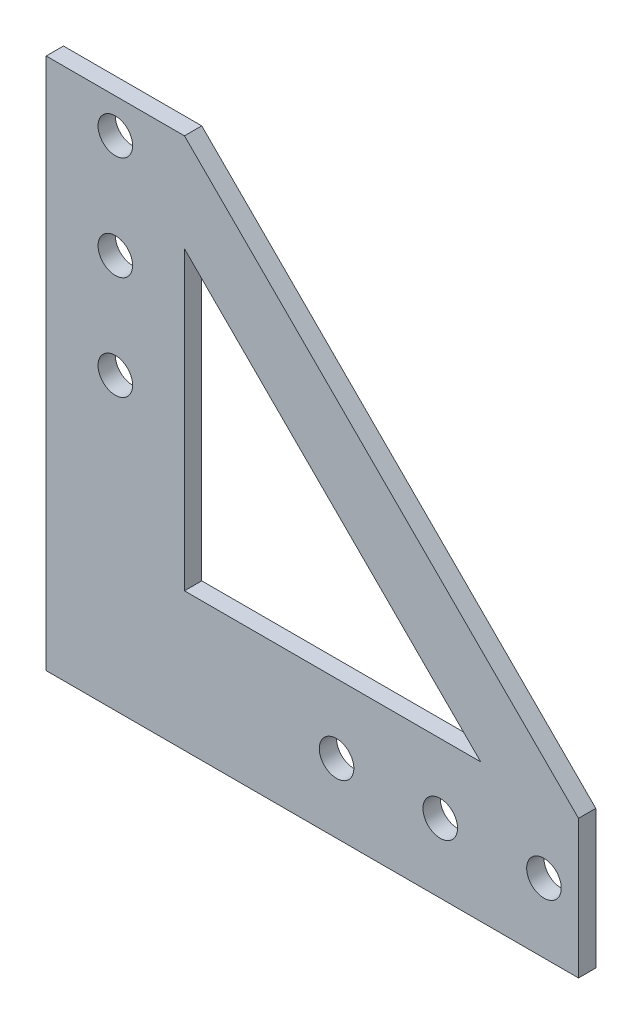
ISO-10303-21;
HEADER;
FILE_DESCRIPTION(('STEP AP214'),'2;1');
FILE_NAME('part.step','',(''),(''),'','','');
FILE_SCHEMA(('AUTOMOTIVE_DESIGN { 1 0 10303 214 1 1 1 1 }'));
ENDSEC;
DATA;
#1=APPLICATION_CONTEXT('core data for automotive mechanical design processes');
#2=APPLICATION_PROTOCOL_DEFINITION('international standard','automotive_design',2000,#1);
#3=PRODUCT_CONTEXT('',#1,'mechanical');
#4=PRODUCT('Part','Part','',(#3));
#5=PRODUCT_RELATED_PRODUCT_CATEGORY('part','',(#4));
#6=PRODUCT_DEFINITION_FORMATION('','',#4);
#7=PRODUCT_DEFINITION_CONTEXT('part definition',#1,'design');
#8=PRODUCT_DEFINITION('design','',#6,#7);
#9=PRODUCT_DEFINITION_SHAPE('','',#8);
#10=(LENGTH_UNIT() NAMED_UNIT(*) SI_UNIT(.MILLI.,.METRE.));
#11=(NAMED_UNIT(*) PLANE_ANGLE_UNIT() SI_UNIT($,.RADIAN.));
#12=(NAMED_UNIT(*) SI_UNIT($,.STERADIAN.) SOLID_ANGLE_UNIT());
#13=UNCERTAINTY_MEASURE_WITH_UNIT(LENGTH_MEASURE(1.E-05),#10,'distance_accuracy_value','');
#14=(GEOMETRIC_REPRESENTATION_CONTEXT(3) GLOBAL_UNCERTAINTY_ASSIGNED_CONTEXT((#13)) GLOBAL_UNIT_ASSIGNED_CONTEXT((#10,
#11,#12)) REPRESENTATION_CONTEXT('',''));
#15=CARTESIAN_POINT('',(0.,0.,0.));
#16=DIRECTION('',(0.,0.,1.));
#17=DIRECTION('',(1.,0.,0.));
#18=AXIS2_PLACEMENT_3D('',#15,#16,#17);
#19=CARTESIAN_POINT('',(0.,0.,3.175));
#20=DIRECTION('',(0.,1.,0.));
#21=DIRECTION('',(0.,0.,1.));
#22=AXIS2_PLACEMENT_3D('',#19,#20,#21);
#23=PLANE('',#22);
#24=DIRECTION('',(1.,0.,0.));
#25=VECTOR('',#24,1.);
#26=CARTESIAN_POINT('',(0.,0.,0.));
#27=LINE('',#26,#25);
#28=CARTESIAN_POINT('',(0.,0.,0.));
#29=VERTEX_POINT('',#28);
#30=CARTESIAN_POINT('',(97.79,0.,0.));
#31=VERTEX_POINT('',#30);
#32=EDGE_CURVE('E145',#29,#31,#27,.T.);
#33=ORIENTED_EDGE('',*,*,#32,.T.);
#34=DIRECTION('',(0.,0.,-1.));
#35=VECTOR('',#34,1.);
#36=CARTESIAN_POINT('',(97.79,0.,3.175));
#37=LINE('',#36,#35);
#38=CARTESIAN_POINT('',(97.79,0.,3.175));
#39=VERTEX_POINT('',#38);
#40=EDGE_CURVE('E11',#39,#31,#37,.T.);
#41=ORIENTED_EDGE('',*,*,#40,.F.);
#42=DIRECTION('',(1.,0.,0.));
#43=VECTOR('',#42,1.);
#44=CARTESIAN_POINT('',(0.,0.,3.175));
#45=LINE('',#44,#43);
#46=CARTESIAN_POINT('',(0.,0.,3.175));
#47=VERTEX_POINT('',#46);
#48=EDGE_CURVE('E177',#47,#39,#45,.T.);
#49=ORIENTED_EDGE('',*,*,#48,.F.);
#50=DIRECTION('',(0.,0.,-1.));
#51=VECTOR('',#50,1.);
#52=CARTESIAN_POINT('',(0.,0.,3.175));
#53=LINE('',#52,#51);
#54=EDGE_CURVE('E54',#47,#29,#53,.T.);
#55=ORIENTED_EDGE('',*,*,#54,.T.);
#56=EDGE_LOOP('',(#33,#41,#49,#55));
#57=FACE_BOUND('',#56,.T.);
#58=ADVANCED_FACE('F35',(#57),#23,.F.);
#59=CARTESIAN_POINT('',(97.79,0.,3.175));
#60=DIRECTION('',(-1.,0.,0.));
#61=DIRECTION('',(0.,-1.,0.));
#62=AXIS2_PLACEMENT_3D('',#59,#60,#61);
#63=PLANE('',#62);
#64=DIRECTION('',(0.,1.,0.));
#65=VECTOR('',#64,1.);
#66=CARTESIAN_POINT('',(97.79,0.,0.));
#67=LINE('',#66,#65);
#68=CARTESIAN_POINT('',(97.79,25.4,0.));
#69=VERTEX_POINT('',#68);
#70=EDGE_CURVE('E147',#31,#69,#67,.T.);
#71=ORIENTED_EDGE('',*,*,#70,.T.);
#72=DIRECTION('',(0.,0.,-1.));
#73=VECTOR('',#72,1.);
#74=CARTESIAN_POINT('',(97.79,25.4,3.175));
#75=LINE('',#74,#73);
#76=CARTESIAN_POINT('',(97.79,25.4,3.175));
#77=VERTEX_POINT('',#76);
#78=EDGE_CURVE('E45',#77,#69,#75,.T.);
#79=ORIENTED_EDGE('',*,*,#78,.F.);
#80=DIRECTION('',(0.,1.,0.));
#81=VECTOR('',#80,1.);
#82=CARTESIAN_POINT('',(97.79,0.,3.175));
#83=LINE('',#82,#81);
#84=EDGE_CURVE('E125',#39,#77,#83,.T.);
#85=ORIENTED_EDGE('',*,*,#84,.F.);
#86=ORIENTED_EDGE('',*,*,#40,.T.);
#87=EDGE_LOOP('',(#71,#79,#85,#86));
#88=FACE_BOUND('',#87,.T.);
#89=ADVANCED_FACE('F256',(#88),#63,.F.);
#90=CARTESIAN_POINT('',(61.595,61.595,3.175));
#91=DIRECTION('',(0.707106781186548,0.707106781186548,0.));
#92=DIRECTION('',(-0.707106781186548,0.707106781186548,0.));
#93=AXIS2_PLACEMENT_3D('',#90,#91,#92);
#94=PLANE('',#93);
#95=DIRECTION('',(0.707106781186548,-0.707106781186548,0.));
#96=VECTOR('',#95,1.);
#97=CARTESIAN_POINT('',(61.595,61.595,0.));
#98=LINE('',#97,#96);
#99=CARTESIAN_POINT('',(25.4,97.79,0.));
#100=VERTEX_POINT('',#99);
#101=EDGE_CURVE('E114',#100,#69,#98,.T.);
#102=ORIENTED_EDGE('',*,*,#101,.F.);
#103=DIRECTION('',(0.,0.,-1.));
#104=VECTOR('',#103,1.);
#105=CARTESIAN_POINT('',(25.4,97.79,3.175));
#106=LINE('',#105,#104);
#107=CARTESIAN_POINT('',(25.4,97.79,3.175));
#108=VERTEX_POINT('',#107);
#109=EDGE_CURVE('E109',#108,#100,#106,.T.);
#110=ORIENTED_EDGE('',*,*,#109,.F.);
#111=DIRECTION('',(0.707106781186548,-0.707106781186548,0.));
#112=VECTOR('',#111,1.);
#113=CARTESIAN_POINT('',(61.595,61.595,3.175));
#114=LINE('',#113,#112);
#115=EDGE_CURVE('E112',#108,#77,#114,.T.);
#116=ORIENTED_EDGE('',*,*,#115,.T.);
#117=ORIENTED_EDGE('',*,*,#78,.T.);
#118=EDGE_LOOP('',(#102,#110,#116,#117));
#119=FACE_BOUND('',#118,.T.);
#120=ADVANCED_FACE('F111',(#119),#94,.T.);
#121=CARTESIAN_POINT('',(0.,97.79,3.175));
#122=DIRECTION('',(0.,1.,0.));
#123=DIRECTION('',(0.,0.,1.));
#124=AXIS2_PLACEMENT_3D('',#121,#122,#123);
#125=PLANE('',#124);
#126=DIRECTION('',(1.,0.,0.));
#127=VECTOR('',#126,1.);
#128=CARTESIAN_POINT('',(0.,97.79,0.));
#129=LINE('',#128,#127);
#130=CARTESIAN_POINT('',(0.,97.79,0.));
#131=VERTEX_POINT('',#130);
#132=EDGE_CURVE('E151',#131,#100,#129,.T.);
#133=ORIENTED_EDGE('',*,*,#132,.F.);
#134=DIRECTION('',(0.,0.,-1.));
#135=VECTOR('',#134,1.);
#136=CARTESIAN_POINT('',(0.,97.79,3.175));
#137=LINE('',#136,#135);
#138=CARTESIAN_POINT('',(0.,97.79,3.175));
#139=VERTEX_POINT('',#138);
#140=EDGE_CURVE('E80',#139,#131,#137,.T.);
#141=ORIENTED_EDGE('',*,*,#140,.F.);
#142=DIRECTION('',(1.,0.,0.));
#143=VECTOR('',#142,1.);
#144=CARTESIAN_POINT('',(0.,97.79,3.175));
#145=LINE('',#144,#143);
#146=EDGE_CURVE('E124',#139,#108,#145,.T.);
#147=ORIENTED_EDGE('',*,*,#146,.T.);
#148=ORIENTED_EDGE('',*,*,#109,.T.);
#149=EDGE_LOOP('',(#133,#141,#147,#148));
#150=FACE_BOUND('',#149,.T.);
#151=ADVANCED_FACE('F128',(#150),#125,.T.);
#152=CARTESIAN_POINT('',(25.4,0.,3.175));
#153=DIRECTION('',(-1.,0.,0.));
#154=DIRECTION('',(0.,-1.,0.));
#155=AXIS2_PLACEMENT_3D('',#152,#153,#154);
#156=PLANE('',#155);
#157=DIRECTION('',(0.,1.,0.));
#158=VECTOR('',#157,1.);
#159=CARTESIAN_POINT('',(25.4,0.,0.));
#160=LINE('',#159,#158);
#161=CARTESIAN_POINT('',(25.4,25.4,0.));
#162=VERTEX_POINT('',#161);
#163=CARTESIAN_POINT('',(25.4,79.8294877578617,0.));
#164=VERTEX_POINT('',#163);
#165=EDGE_CURVE('E135',#162,#164,#160,.T.);
#166=ORIENTED_EDGE('',*,*,#165,.T.);
#167=DIRECTION('',(0.,0.,-1.));
#168=VECTOR('',#167,1.);
#169=CARTESIAN_POINT('',(25.4,79.8294877578617,3.175));
#170=LINE('',#169,#168);
#171=CARTESIAN_POINT('',(25.4,79.8294877578617,3.175));
#172=VERTEX_POINT('',#171);
#173=EDGE_CURVE('E39',#172,#164,#170,.T.);
#174=ORIENTED_EDGE('',*,*,#173,.F.);
#175=DIRECTION('',(0.,1.,0.));
#176=VECTOR('',#175,1.);
#177=CARTESIAN_POINT('',(25.4,0.,3.175));
#178=LINE('',#177,#176);
#179=CARTESIAN_POINT('',(25.4,25.4,3.175));
#180=VERTEX_POINT('',#179);
#181=EDGE_CURVE('E156',#180,#172,#178,.T.);
#182=ORIENTED_EDGE('',*,*,#181,.F.);
#183=DIRECTION('',(0.,0.,-1.));
#184=VECTOR('',#183,1.);
#185=CARTESIAN_POINT('',(25.4,25.4,3.175));
#186=LINE('',#185,#184);
#187=EDGE_CURVE('E131',#180,#162,#186,.T.);
#188=ORIENTED_EDGE('',*,*,#187,.T.);
#189=EDGE_LOOP('',(#166,#174,#182,#188));
#190=FACE_BOUND('',#189,.T.);
#191=ADVANCED_FACE('F37',(#190),#156,.F.);
#192=CARTESIAN_POINT('',(52.6147438789308,52.6147438789309,3.175));
#193=DIRECTION('',(0.707106781186547,0.707106781186548,0.));
#194=DIRECTION('',(-0.707106781186548,0.707106781186547,0.));
#195=AXIS2_PLACEMENT_3D('',#192,#193,#194);
#196=PLANE('',#195);
#197=DIRECTION('',(0.707106781186548,-0.707106781186547,0.));
#198=VECTOR('',#197,1.);
#199=CARTESIAN_POINT('',(52.6147438789308,52.6147438789309,0.));
#200=LINE('',#199,#198);
#201=CARTESIAN_POINT('',(79.8294877578617,25.4,0.));
#202=VERTEX_POINT('',#201);
#203=EDGE_CURVE('E138',#164,#202,#200,.T.);
#204=ORIENTED_EDGE('',*,*,#203,.T.);
#205=DIRECTION('',(0.,0.,-1.));
#206=VECTOR('',#205,1.);
#207=CARTESIAN_POINT('',(79.8294877578617,25.4,3.175));
#208=LINE('',#207,#206);
#209=CARTESIAN_POINT('',(79.8294877578617,25.4,3.175));
#210=VERTEX_POINT('',#209);
#211=EDGE_CURVE('E160',#210,#202,#208,.T.);
#212=ORIENTED_EDGE('',*,*,#211,.F.);
#213=DIRECTION('',(0.707106781186548,-0.707106781186547,0.));
#214=VECTOR('',#213,1.);
#215=CARTESIAN_POINT('',(52.6147438789308,52.6147438789309,3.175));
#216=LINE('',#215,#214);
#217=EDGE_CURVE('E93',#172,#210,#216,.T.);
#218=ORIENTED_EDGE('',*,*,#217,.F.);
#219=ORIENTED_EDGE('',*,*,#173,.T.);
#220=EDGE_LOOP('',(#204,#212,#218,#219));
#221=FACE_BOUND('',#220,.T.);
#222=ADVANCED_FACE('F165',(#221),#196,.F.);
#223=CARTESIAN_POINT('',(0.,25.4,3.175));
#224=DIRECTION('',(0.,1.,0.));
#225=DIRECTION('',(-1.,0.,0.));
#226=AXIS2_PLACEMENT_3D('',#223,#224,#225);
#227=PLANE('',#226);
#228=DIRECTION('',(1.,0.,0.));
#229=VECTOR('',#228,1.);
#230=CARTESIAN_POINT('',(0.,25.4,0.));
#231=LINE('',#230,#229);
#232=EDGE_CURVE('E142',#162,#202,#231,.T.);
#233=ORIENTED_EDGE('',*,*,#232,.F.);
#234=ORIENTED_EDGE('',*,*,#187,.F.);
#235=DIRECTION('',(1.,0.,0.));
#236=VECTOR('',#235,1.);
#237=CARTESIAN_POINT('',(0.,25.4,3.175));
#238=LINE('',#237,#236);
#239=EDGE_CURVE('E174',#180,#210,#238,.T.);
#240=ORIENTED_EDGE('',*,*,#239,.T.);
#241=ORIENTED_EDGE('',*,*,#211,.T.);
#242=EDGE_LOOP('',(#233,#234,#240,#241));
#243=FACE_BOUND('',#242,.T.);
#244=ADVANCED_FACE('F172',(#243),#227,.T.);
#245=CARTESIAN_POINT('',(0.,0.,3.175));
#246=DIRECTION('',(-1.,0.,0.));
#247=DIRECTION('',(0.,0.,1.));
#248=AXIS2_PLACEMENT_3D('',#245,#246,#247);
#249=PLANE('',#248);
#250=DIRECTION('',(0.,1.,0.));
#251=VECTOR('',#250,1.);
#252=CARTESIAN_POINT('',(0.,0.,0.));
#253=LINE('',#252,#251);
#254=EDGE_CURVE('E153',#29,#131,#253,.T.);
#255=ORIENTED_EDGE('',*,*,#254,.F.);
#256=ORIENTED_EDGE('',*,*,#54,.F.);
#257=DIRECTION('',(0.,1.,0.));
#258=VECTOR('',#257,1.);
#259=CARTESIAN_POINT('',(0.,0.,3.175));
#260=LINE('',#259,#258);
#261=EDGE_CURVE('E129',#47,#139,#260,.T.);
#262=ORIENTED_EDGE('',*,*,#261,.T.);
#263=ORIENTED_EDGE('',*,*,#140,.T.);
#264=EDGE_LOOP('',(#255,#256,#262,#263));
#265=FACE_BOUND('',#264,.T.);
#266=ADVANCED_FACE('F229',(#265),#249,.T.);
#267=CARTESIAN_POINT('',(0.,0.,3.175));
#268=DIRECTION('',(0.,0.,1.));
#269=DIRECTION('',(1.,0.,0.));
#270=AXIS2_PLACEMENT_3D('',#267,#268,#269);
#271=PLANE('',#270);
#272=CARTESIAN_POINT('',(91.44,12.7,3.175));
#273=DIRECTION('',(0.,0.,1.));
#274=DIRECTION('',(1.,0.,0.));
#275=AXIS2_PLACEMENT_3D('',#272,#273,#274);
#276=CIRCLE('',#275,3.175);
#277=CARTESIAN_POINT('',(94.615,12.7,3.175));
#278=VERTEX_POINT('',#277);
#279=EDGE_CURVE('E212',#278,#278,#276,.T.);
#280=ORIENTED_EDGE('',*,*,#279,.F.);
#281=EDGE_LOOP('',(#280));
#282=FACE_BOUND('',#281,.T.);
#283=CARTESIAN_POINT('',(12.7,91.44,3.175));
#284=DIRECTION('',(0.,0.,1.));
#285=DIRECTION('',(1.,0.,0.));
#286=AXIS2_PLACEMENT_3D('',#283,#284,#285);
#287=CIRCLE('',#286,3.175);
#288=CARTESIAN_POINT('',(15.875,91.44,3.175));
#289=VERTEX_POINT('',#288);
#290=EDGE_CURVE('E206',#289,#289,#287,.T.);
#291=ORIENTED_EDGE('',*,*,#290,.F.);
#292=EDGE_LOOP('',(#291));
#293=FACE_BOUND('',#292,.T.);
#294=CARTESIAN_POINT('',(12.7,72.39,3.175));
#295=DIRECTION('',(0.,0.,1.));
#296=DIRECTION('',(1.,0.,0.));
#297=AXIS2_PLACEMENT_3D('',#294,#295,#296);
#298=CIRCLE('',#297,3.175);
#299=CARTESIAN_POINT('',(15.875,72.39,3.175));
#300=VERTEX_POINT('',#299);
#301=EDGE_CURVE('E200',#300,#300,#298,.T.);
#302=ORIENTED_EDGE('',*,*,#301,.F.);
#303=EDGE_LOOP('',(#302));
#304=FACE_BOUND('',#303,.T.);
#305=CARTESIAN_POINT('',(12.7,53.34,3.175));
#306=DIRECTION('',(0.,0.,1.));
#307=DIRECTION('',(1.,0.,0.));
#308=AXIS2_PLACEMENT_3D('',#305,#306,#307);
#309=CIRCLE('',#308,3.175);
#310=CARTESIAN_POINT('',(15.875,53.34,3.175));
#311=VERTEX_POINT('',#310);
#312=EDGE_CURVE('E194',#311,#311,#309,.T.);
#313=ORIENTED_EDGE('',*,*,#312,.F.);
#314=EDGE_LOOP('',(#313));
#315=FACE_BOUND('',#314,.T.);
#316=CARTESIAN_POINT('',(72.39,12.7,3.175));
#317=DIRECTION('',(0.,0.,1.));
#318=DIRECTION('',(1.,0.,0.));
#319=AXIS2_PLACEMENT_3D('',#316,#317,#318);
#320=CIRCLE('',#319,3.175);
#321=CARTESIAN_POINT('',(75.565,12.7,3.175));
#322=VERTEX_POINT('',#321);
#323=EDGE_CURVE('E188',#322,#322,#320,.T.);
#324=ORIENTED_EDGE('',*,*,#323,.F.);
#325=EDGE_LOOP('',(#324));
#326=FACE_BOUND('',#325,.T.);
#327=CARTESIAN_POINT('',(53.34,12.7,3.175));
#328=DIRECTION('',(0.,0.,1.));
#329=DIRECTION('',(1.,0.,0.));
#330=AXIS2_PLACEMENT_3D('',#327,#328,#329);
#331=CIRCLE('',#330,3.175);
#332=CARTESIAN_POINT('',(56.515,12.7,3.175));
#333=VERTEX_POINT('',#332);
#334=EDGE_CURVE('E182',#333,#333,#331,.T.);
#335=ORIENTED_EDGE('',*,*,#334,.F.);
#336=EDGE_LOOP('',(#335));
#337=FACE_BOUND('',#336,.T.);
#338=ORIENTED_EDGE('',*,*,#181,.T.);
#339=ORIENTED_EDGE('',*,*,#217,.T.);
#340=ORIENTED_EDGE('',*,*,#239,.F.);
#341=EDGE_LOOP('',(#338,#339,#340));
#342=FACE_BOUND('',#341,.T.);
#343=ORIENTED_EDGE('',*,*,#48,.T.);
#344=ORIENTED_EDGE('',*,*,#84,.T.);
#345=ORIENTED_EDGE('',*,*,#115,.F.);
#346=ORIENTED_EDGE('',*,*,#146,.F.);
#347=ORIENTED_EDGE('',*,*,#261,.F.);
#348=EDGE_LOOP('',(#343,#344,#345,#346,#347));
#349=FACE_BOUND('',#348,.T.);
#350=ADVANCED_FACE('F122',(#282,#293,#304,#315,#326,#337,#342,#349),#271,.T.);
#351=CARTESIAN_POINT('',(0.,0.,0.));
#352=DIRECTION('',(0.,0.,1.));
#353=DIRECTION('',(1.,0.,0.));
#354=AXIS2_PLACEMENT_3D('',#351,#352,#353);
#355=PLANE('',#354);
#356=CARTESIAN_POINT('',(91.44,12.7,0.));
#357=DIRECTION('',(0.,0.,1.));
#358=DIRECTION('',(1.,0.,0.));
#359=AXIS2_PLACEMENT_3D('',#356,#357,#358);
#360=CIRCLE('',#359,3.175);
#361=CARTESIAN_POINT('',(94.615,12.7,0.));
#362=VERTEX_POINT('',#361);
#363=EDGE_CURVE('E209',#362,#362,#360,.T.);
#364=ORIENTED_EDGE('',*,*,#363,.T.);
#365=EDGE_LOOP('',(#364));
#366=FACE_BOUND('',#365,.T.);
#367=CARTESIAN_POINT('',(12.7,91.44,0.));
#368=DIRECTION('',(0.,0.,1.));
#369=DIRECTION('',(1.,0.,0.));
#370=AXIS2_PLACEMENT_3D('',#367,#368,#369);
#371=CIRCLE('',#370,3.175);
#372=CARTESIAN_POINT('',(15.875,91.44,0.));
#373=VERTEX_POINT('',#372);
#374=EDGE_CURVE('E203',#373,#373,#371,.T.);
#375=ORIENTED_EDGE('',*,*,#374,.T.);
#376=EDGE_LOOP('',(#375));
#377=FACE_BOUND('',#376,.T.);
#378=CARTESIAN_POINT('',(12.7,72.39,0.));
#379=DIRECTION('',(0.,0.,1.));
#380=DIRECTION('',(1.,0.,0.));
#381=AXIS2_PLACEMENT_3D('',#378,#379,#380);
#382=CIRCLE('',#381,3.175);
#383=CARTESIAN_POINT('',(15.875,72.39,0.));
#384=VERTEX_POINT('',#383);
#385=EDGE_CURVE('E197',#384,#384,#382,.T.);
#386=ORIENTED_EDGE('',*,*,#385,.T.);
#387=EDGE_LOOP('',(#386));
#388=FACE_BOUND('',#387,.T.);
#389=CARTESIAN_POINT('',(12.7,53.34,0.));
#390=DIRECTION('',(0.,0.,1.));
#391=DIRECTION('',(1.,0.,0.));
#392=AXIS2_PLACEMENT_3D('',#389,#390,#391);
#393=CIRCLE('',#392,3.175);
#394=CARTESIAN_POINT('',(15.875,53.34,0.));
#395=VERTEX_POINT('',#394);
#396=EDGE_CURVE('E191',#395,#395,#393,.T.);
#397=ORIENTED_EDGE('',*,*,#396,.T.);
#398=EDGE_LOOP('',(#397));
#399=FACE_BOUND('',#398,.T.);
#400=CARTESIAN_POINT('',(72.39,12.7,0.));
#401=DIRECTION('',(0.,0.,1.));
#402=DIRECTION('',(1.,0.,0.));
#403=AXIS2_PLACEMENT_3D('',#400,#401,#402);
#404=CIRCLE('',#403,3.175);
#405=CARTESIAN_POINT('',(75.565,12.7,0.));
#406=VERTEX_POINT('',#405);
#407=EDGE_CURVE('E185',#406,#406,#404,.T.);
#408=ORIENTED_EDGE('',*,*,#407,.T.);
#409=EDGE_LOOP('',(#408));
#410=FACE_BOUND('',#409,.T.);
#411=CARTESIAN_POINT('',(53.34,12.7,0.));
#412=DIRECTION('',(0.,0.,1.));
#413=DIRECTION('',(1.,0.,0.));
#414=AXIS2_PLACEMENT_3D('',#411,#412,#413);
#415=CIRCLE('',#414,3.175);
#416=CARTESIAN_POINT('',(56.515,12.7,0.));
#417=VERTEX_POINT('',#416);
#418=EDGE_CURVE('E139',#417,#417,#415,.T.);
#419=ORIENTED_EDGE('',*,*,#418,.T.);
#420=EDGE_LOOP('',(#419));
#421=FACE_BOUND('',#420,.T.);
#422=ORIENTED_EDGE('',*,*,#165,.F.);
#423=ORIENTED_EDGE('',*,*,#232,.T.);
#424=ORIENTED_EDGE('',*,*,#203,.F.);
#425=EDGE_LOOP('',(#422,#423,#424));
#426=FACE_BOUND('',#425,.T.);
#427=ORIENTED_EDGE('',*,*,#32,.F.);
#428=ORIENTED_EDGE('',*,*,#254,.T.);
#429=ORIENTED_EDGE('',*,*,#132,.T.);
#430=ORIENTED_EDGE('',*,*,#101,.T.);
#431=ORIENTED_EDGE('',*,*,#70,.F.);
#432=EDGE_LOOP('',(#427,#428,#429,#430,#431));
#433=FACE_BOUND('',#432,.T.);
#434=ADVANCED_FACE('F170',(#366,#377,#388,#399,#410,#421,#426,#433),#355,.F.);
#435=CARTESIAN_POINT('',(53.34,12.7,0.));
#436=DIRECTION('',(0.,0.,1.));
#437=DIRECTION('',(1.,0.,0.));
#438=AXIS2_PLACEMENT_3D('',#435,#436,#437);
#439=CYLINDRICAL_SURFACE('',#438,3.175);
#440=ORIENTED_EDGE('',*,*,#418,.F.);
#441=EDGE_LOOP('',(#440));
#442=FACE_BOUND('',#441,.T.);
#443=ORIENTED_EDGE('',*,*,#334,.T.);
#444=EDGE_LOOP('',(#443));
#445=FACE_BOUND('',#444,.T.);
#446=ADVANCED_FACE('F241',(#442,#445),#439,.F.);
#447=CARTESIAN_POINT('',(72.39,12.7,0.));
#448=DIRECTION('',(0.,0.,1.));
#449=DIRECTION('',(1.,0.,0.));
#450=AXIS2_PLACEMENT_3D('',#447,#448,#449);
#451=CYLINDRICAL_SURFACE('',#450,3.175);
#452=ORIENTED_EDGE('',*,*,#407,.F.);
#453=EDGE_LOOP('',(#452));
#454=FACE_BOUND('',#453,.T.);
#455=ORIENTED_EDGE('',*,*,#323,.T.);
#456=EDGE_LOOP('',(#455));
#457=FACE_BOUND('',#456,.T.);
#458=ADVANCED_FACE('F243',(#454,#457),#451,.F.);
#459=CARTESIAN_POINT('',(12.7,53.34,0.));
#460=DIRECTION('',(0.,0.,1.));
#461=DIRECTION('',(1.,0.,0.));
#462=AXIS2_PLACEMENT_3D('',#459,#460,#461);
#463=CYLINDRICAL_SURFACE('',#462,3.175);
#464=ORIENTED_EDGE('',*,*,#396,.F.);
#465=EDGE_LOOP('',(#464));
#466=FACE_BOUND('',#465,.T.);
#467=ORIENTED_EDGE('',*,*,#312,.T.);
#468=EDGE_LOOP('',(#467));
#469=FACE_BOUND('',#468,.T.);
#470=ADVANCED_FACE('F250',(#466,#469),#463,.F.);
#471=CARTESIAN_POINT('',(12.7,72.39,0.));
#472=DIRECTION('',(0.,0.,1.));
#473=DIRECTION('',(1.,0.,0.));
#474=AXIS2_PLACEMENT_3D('',#471,#472,#473);
#475=CYLINDRICAL_SURFACE('',#474,3.175);
#476=ORIENTED_EDGE('',*,*,#385,.F.);
#477=EDGE_LOOP('',(#476));
#478=FACE_BOUND('',#477,.T.);
#479=ORIENTED_EDGE('',*,*,#301,.T.);
#480=EDGE_LOOP('',(#479));
#481=FACE_BOUND('',#480,.T.);
#482=ADVANCED_FACE('F311',(#478,#481),#475,.F.);
#483=CARTESIAN_POINT('',(12.7,91.44,0.));
#484=DIRECTION('',(0.,0.,1.));
#485=DIRECTION('',(1.,0.,0.));
#486=AXIS2_PLACEMENT_3D('',#483,#484,#485);
#487=CYLINDRICAL_SURFACE('',#486,3.175);
#488=ORIENTED_EDGE('',*,*,#374,.F.);
#489=EDGE_LOOP('',(#488));
#490=FACE_BOUND('',#489,.T.);
#491=ORIENTED_EDGE('',*,*,#290,.T.);
#492=EDGE_LOOP('',(#491));
#493=FACE_BOUND('',#492,.T.);
#494=ADVANCED_FACE('F223',(#490,#493),#487,.F.);
#495=CARTESIAN_POINT('',(91.44,12.7,0.));
#496=DIRECTION('',(0.,0.,1.));
#497=DIRECTION('',(1.,0.,0.));
#498=AXIS2_PLACEMENT_3D('',#495,#496,#497);
#499=CYLINDRICAL_SURFACE('',#498,3.175);
#500=ORIENTED_EDGE('',*,*,#363,.F.);
#501=EDGE_LOOP('',(#500));
#502=FACE_BOUND('',#501,.T.);
#503=ORIENTED_EDGE('',*,*,#279,.T.);
#504=EDGE_LOOP('',(#503));
#505=FACE_BOUND('',#504,.T.);
#506=ADVANCED_FACE('F220',(#502,#505),#499,.F.);
#507=CLOSED_SHELL('',(#58,#89,#120,#151,#191,#222,#244,#266,#350,#434,#446,#458,#470,#482,#494,#506));
#508=MANIFOLD_SOLID_BREP('B2',#507);
#509=ADVANCED_BREP_SHAPE_REPRESENTATION('',(#18,#508),#14);
#510=SHAPE_DEFINITION_REPRESENTATION(#9,#509);
ENDSEC;
END-ISO-10303-21;
